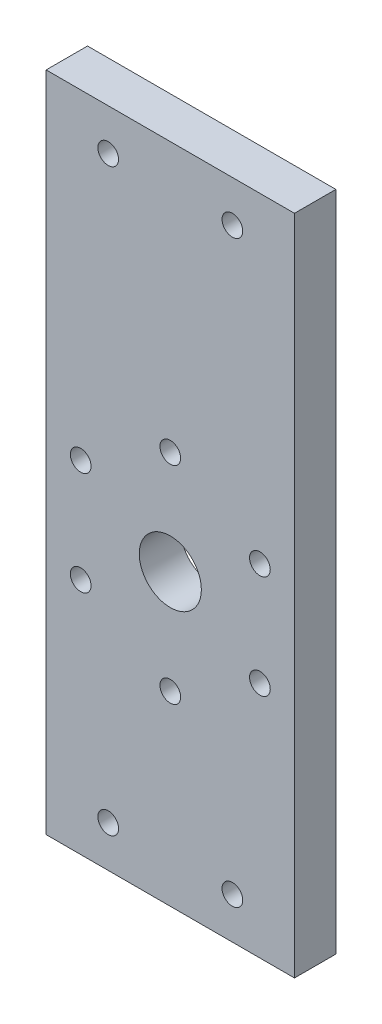
ISO-10303-21;
HEADER;
FILE_DESCRIPTION(('STEP AP214'),'2;1');
FILE_NAME('part.step','',(''),(''),'','','');
FILE_SCHEMA(('AUTOMOTIVE_DESIGN { 1 0 10303 214 1 1 1 1 }'));
ENDSEC;
DATA;
#1=APPLICATION_CONTEXT('core data for automotive mechanical design processes');
#2=APPLICATION_PROTOCOL_DEFINITION('international standard','automotive_design',2000,#1);
#3=PRODUCT_CONTEXT('',#1,'mechanical');
#4=PRODUCT('Part','Part','',(#3));
#5=PRODUCT_RELATED_PRODUCT_CATEGORY('part','',(#4));
#6=PRODUCT_DEFINITION_FORMATION('','',#4);
#7=PRODUCT_DEFINITION_CONTEXT('part definition',#1,'design');
#8=PRODUCT_DEFINITION('design','',#6,#7);
#9=PRODUCT_DEFINITION_SHAPE('','',#8);
#10=(LENGTH_UNIT() NAMED_UNIT(*) SI_UNIT(.MILLI.,.METRE.));
#11=(NAMED_UNIT(*) PLANE_ANGLE_UNIT() SI_UNIT($,.RADIAN.));
#12=(NAMED_UNIT(*) SI_UNIT($,.STERADIAN.) SOLID_ANGLE_UNIT());
#13=UNCERTAINTY_MEASURE_WITH_UNIT(LENGTH_MEASURE(1.E-05),#10,'distance_accuracy_value','');
#14=(GEOMETRIC_REPRESENTATION_CONTEXT(3) GLOBAL_UNCERTAINTY_ASSIGNED_CONTEXT((#13)) GLOBAL_UNIT_ASSIGNED_CONTEXT((#10,
#11,#12)) REPRESENTATION_CONTEXT('',''));
#15=CARTESIAN_POINT('',(0.,0.,0.));
#16=DIRECTION('',(0.,0.,1.));
#17=DIRECTION('',(1.,0.,0.));
#18=AXIS2_PLACEMENT_3D('',#15,#16,#17);
#19=CARTESIAN_POINT('',(0.,0.,12.7));
#20=DIRECTION('',(1.,0.,0.));
#21=DIRECTION('',(0.,0.,-1.));
#22=AXIS2_PLACEMENT_3D('',#19,#20,#21);
#23=PLANE('',#22);
#24=DIRECTION('',(0.,-1.,0.));
#25=VECTOR('',#24,1.);
#26=CARTESIAN_POINT('',(0.,0.,0.));
#27=LINE('',#26,#25);
#28=CARTESIAN_POINT('',(0.,203.2,0.));
#29=VERTEX_POINT('',#28);
#30=CARTESIAN_POINT('',(0.,0.,0.));
#31=VERTEX_POINT('',#30);
#32=EDGE_CURVE('E95',#29,#31,#27,.T.);
#33=ORIENTED_EDGE('',*,*,#32,.T.);
#34=DIRECTION('',(0.,0.,-1.));
#35=VECTOR('',#34,1.);
#36=CARTESIAN_POINT('',(0.,0.,12.7));
#37=LINE('',#36,#35);
#38=CARTESIAN_POINT('',(0.,0.,12.7));
#39=VERTEX_POINT('',#38);
#40=EDGE_CURVE('E11',#39,#31,#37,.T.);
#41=ORIENTED_EDGE('',*,*,#40,.F.);
#42=DIRECTION('',(0.,-1.,0.));
#43=VECTOR('',#42,1.);
#44=CARTESIAN_POINT('',(0.,0.,12.7));
#45=LINE('',#44,#43);
#46=CARTESIAN_POINT('',(0.,203.2,12.7));
#47=VERTEX_POINT('',#46);
#48=EDGE_CURVE('E83',#47,#39,#45,.T.);
#49=ORIENTED_EDGE('',*,*,#48,.F.);
#50=DIRECTION('',(0.,0.,-1.));
#51=VECTOR('',#50,1.);
#52=CARTESIAN_POINT('',(0.,203.2,12.7));
#53=LINE('',#52,#51);
#54=EDGE_CURVE('E91',#47,#29,#53,.T.);
#55=ORIENTED_EDGE('',*,*,#54,.T.);
#56=EDGE_LOOP('',(#33,#41,#49,#55));
#57=FACE_BOUND('',#56,.T.);
#58=ADVANCED_FACE('F32',(#57),#23,.F.);
#59=CARTESIAN_POINT('',(0.,0.,12.7));
#60=DIRECTION('',(0.,1.,0.));
#61=DIRECTION('',(0.,0.,1.));
#62=AXIS2_PLACEMENT_3D('',#59,#60,#61);
#63=PLANE('',#62);
#64=DIRECTION('',(1.,0.,0.));
#65=VECTOR('',#64,1.);
#66=CARTESIAN_POINT('',(0.,0.,0.));
#67=LINE('',#66,#65);
#68=CARTESIAN_POINT('',(76.2,0.,0.));
#69=VERTEX_POINT('',#68);
#70=EDGE_CURVE('E87',#31,#69,#67,.T.);
#71=ORIENTED_EDGE('',*,*,#70,.T.);
#72=DIRECTION('',(0.,0.,-1.));
#73=VECTOR('',#72,1.);
#74=CARTESIAN_POINT('',(76.2,0.,12.7));
#75=LINE('',#74,#73);
#76=CARTESIAN_POINT('',(76.2,0.,12.7));
#77=VERTEX_POINT('',#76);
#78=EDGE_CURVE('E40',#77,#69,#75,.T.);
#79=ORIENTED_EDGE('',*,*,#78,.F.);
#80=DIRECTION('',(1.,0.,0.));
#81=VECTOR('',#80,1.);
#82=CARTESIAN_POINT('',(0.,0.,12.7));
#83=LINE('',#82,#81);
#84=EDGE_CURVE('E78',#39,#77,#83,.T.);
#85=ORIENTED_EDGE('',*,*,#84,.F.);
#86=ORIENTED_EDGE('',*,*,#40,.T.);
#87=EDGE_LOOP('',(#71,#79,#85,#86));
#88=FACE_BOUND('',#87,.T.);
#89=ADVANCED_FACE('F86',(#88),#63,.F.);
#90=CARTESIAN_POINT('',(76.2,0.,12.7));
#91=DIRECTION('',(-1.,0.,0.));
#92=DIRECTION('',(0.,0.,1.));
#93=AXIS2_PLACEMENT_3D('',#90,#91,#92);
#94=PLANE('',#93);
#95=DIRECTION('',(0.,1.,0.));
#96=VECTOR('',#95,1.);
#97=CARTESIAN_POINT('',(76.2,0.,0.));
#98=LINE('',#97,#96);
#99=CARTESIAN_POINT('',(76.2,203.2,0.));
#100=VERTEX_POINT('',#99);
#101=EDGE_CURVE('E65',#69,#100,#98,.T.);
#102=ORIENTED_EDGE('',*,*,#101,.T.);
#103=DIRECTION('',(0.,0.,-1.));
#104=VECTOR('',#103,1.);
#105=CARTESIAN_POINT('',(76.2,203.2,12.7));
#106=LINE('',#105,#104);
#107=CARTESIAN_POINT('',(76.2,203.2,12.7));
#108=VERTEX_POINT('',#107);
#109=EDGE_CURVE('E88',#108,#100,#106,.T.);
#110=ORIENTED_EDGE('',*,*,#109,.F.);
#111=DIRECTION('',(0.,1.,0.));
#112=VECTOR('',#111,1.);
#113=CARTESIAN_POINT('',(76.2,0.,12.7));
#114=LINE('',#113,#112);
#115=EDGE_CURVE('E81',#77,#108,#114,.T.);
#116=ORIENTED_EDGE('',*,*,#115,.F.);
#117=ORIENTED_EDGE('',*,*,#78,.T.);
#118=EDGE_LOOP('',(#102,#110,#116,#117));
#119=FACE_BOUND('',#118,.T.);
#120=ADVANCED_FACE('F89',(#119),#94,.F.);
#121=CARTESIAN_POINT('',(0.,203.2,12.7));
#122=DIRECTION('',(0.,-1.,0.));
#123=DIRECTION('',(0.,0.,-1.));
#124=AXIS2_PLACEMENT_3D('',#121,#122,#123);
#125=PLANE('',#124);
#126=DIRECTION('',(-1.,0.,0.));
#127=VECTOR('',#126,1.);
#128=CARTESIAN_POINT('',(0.,203.2,0.));
#129=LINE('',#128,#127);
#130=EDGE_CURVE('E71',#100,#29,#129,.T.);
#131=ORIENTED_EDGE('',*,*,#130,.T.);
#132=ORIENTED_EDGE('',*,*,#54,.F.);
#133=DIRECTION('',(-1.,0.,0.));
#134=VECTOR('',#133,1.);
#135=CARTESIAN_POINT('',(0.,203.2,12.7));
#136=LINE('',#135,#134);
#137=EDGE_CURVE('E48',#108,#47,#136,.T.);
#138=ORIENTED_EDGE('',*,*,#137,.F.);
#139=ORIENTED_EDGE('',*,*,#109,.T.);
#140=EDGE_LOOP('',(#131,#132,#138,#139));
#141=FACE_BOUND('',#140,.T.);
#142=ADVANCED_FACE('F103',(#141),#125,.F.);
#143=CARTESIAN_POINT('',(0.,0.,12.7));
#144=DIRECTION('',(0.,0.,-1.));
#145=DIRECTION('',(-1.,0.,0.));
#146=AXIS2_PLACEMENT_3D('',#143,#144,#145);
#147=PLANE('',#146);
#148=CARTESIAN_POINT('',(38.1,120.65,12.7));
#149=DIRECTION('',(0.,0.,1.));
#150=DIRECTION('',(1.,0.,0.));
#151=AXIS2_PLACEMENT_3D('',#148,#149,#150);
#152=CIRCLE('',#151,3.175);
#153=CARTESIAN_POINT('',(41.275,120.65,12.7));
#154=VERTEX_POINT('',#153);
#155=EDGE_CURVE('E162',#154,#154,#152,.T.);
#156=ORIENTED_EDGE('',*,*,#155,.F.);
#157=EDGE_LOOP('',(#156));
#158=FACE_BOUND('',#157,.T.);
#159=CARTESIAN_POINT('',(10.6036934298447,104.775,12.7));
#160=DIRECTION('',(0.,0.,1.));
#161=DIRECTION('',(1.,0.,0.));
#162=AXIS2_PLACEMENT_3D('',#159,#160,#161);
#163=CIRCLE('',#162,3.17500000000001);
#164=CARTESIAN_POINT('',(13.7786934298447,104.775,12.7));
#165=VERTEX_POINT('',#164);
#166=EDGE_CURVE('E167',#165,#165,#163,.T.);
#167=ORIENTED_EDGE('',*,*,#166,.F.);
#168=EDGE_LOOP('',(#167));
#169=FACE_BOUND('',#168,.T.);
#170=CARTESIAN_POINT('',(10.6036934298441,73.025,12.7));
#171=DIRECTION('',(0.,0.,1.));
#172=DIRECTION('',(1.,0.,0.));
#173=AXIS2_PLACEMENT_3D('',#170,#171,#172);
#174=CIRCLE('',#173,3.17499999999877);
#175=CARTESIAN_POINT('',(13.7786934298429,73.025,12.7));
#176=VERTEX_POINT('',#175);
#177=EDGE_CURVE('E143',#176,#176,#174,.T.);
#178=ORIENTED_EDGE('',*,*,#177,.F.);
#179=EDGE_LOOP('',(#178));
#180=FACE_BOUND('',#179,.T.);
#181=CARTESIAN_POINT('',(38.1,57.15,12.7));
#182=DIRECTION('',(0.,0.,1.));
#183=DIRECTION('',(1.,0.,0.));
#184=AXIS2_PLACEMENT_3D('',#181,#182,#183);
#185=CIRCLE('',#184,3.1749999999985);
#186=CARTESIAN_POINT('',(41.2749999999985,57.15,12.7));
#187=VERTEX_POINT('',#186);
#188=EDGE_CURVE('E142',#187,#187,#185,.T.);
#189=ORIENTED_EDGE('',*,*,#188,.F.);
#190=EDGE_LOOP('',(#189));
#191=FACE_BOUND('',#190,.T.);
#192=CARTESIAN_POINT('',(65.5963065701559,73.025,12.7));
#193=DIRECTION('',(0.,0.,1.));
#194=DIRECTION('',(1.,0.,0.));
#195=AXIS2_PLACEMENT_3D('',#192,#193,#194);
#196=CIRCLE('',#195,3.17499999999907);
#197=CARTESIAN_POINT('',(68.771306570155,73.025,12.7));
#198=VERTEX_POINT('',#197);
#199=EDGE_CURVE('E150',#198,#198,#196,.T.);
#200=ORIENTED_EDGE('',*,*,#199,.F.);
#201=EDGE_LOOP('',(#200));
#202=FACE_BOUND('',#201,.T.);
#203=CARTESIAN_POINT('',(65.5963065701564,104.775000000001,12.7));
#204=DIRECTION('',(0.,0.,1.));
#205=DIRECTION('',(1.,0.,0.));
#206=AXIS2_PLACEMENT_3D('',#203,#204,#205);
#207=CIRCLE('',#206,3.17499999999999);
#208=CARTESIAN_POINT('',(68.7713065701564,104.775000000001,12.7));
#209=VERTEX_POINT('',#208);
#210=EDGE_CURVE('E156',#209,#209,#207,.T.);
#211=ORIENTED_EDGE('',*,*,#210,.F.);
#212=EDGE_LOOP('',(#211));
#213=FACE_BOUND('',#212,.T.);
#214=CARTESIAN_POINT('',(38.1,88.9,12.7));
#215=DIRECTION('',(0.,0.,1.));
#216=DIRECTION('',(1.,0.,0.));
#217=AXIS2_PLACEMENT_3D('',#214,#215,#216);
#218=CIRCLE('',#217,9.525);
#219=CARTESIAN_POINT('',(47.625,88.9,12.7));
#220=VERTEX_POINT('',#219);
#221=EDGE_CURVE('E135',#220,#220,#218,.T.);
#222=ORIENTED_EDGE('',*,*,#221,.F.);
#223=EDGE_LOOP('',(#222));
#224=FACE_BOUND('',#223,.T.);
#225=CARTESIAN_POINT('',(57.15,12.7,12.7));
#226=DIRECTION('',(0.,0.,-1.));
#227=DIRECTION('',(-1.,0.,0.));
#228=AXIS2_PLACEMENT_3D('',#225,#226,#227);
#229=CIRCLE('',#228,3.175);
#230=CARTESIAN_POINT('',(53.975,12.7,12.7));
#231=VERTEX_POINT('',#230);
#232=EDGE_CURVE('E115',#231,#231,#229,.F.);
#233=ORIENTED_EDGE('',*,*,#232,.F.);
#234=EDGE_LOOP('',(#233));
#235=FACE_BOUND('',#234,.T.);
#236=CARTESIAN_POINT('',(19.05,12.7,12.7));
#237=DIRECTION('',(0.,0.,-1.));
#238=DIRECTION('',(-1.,0.,0.));
#239=AXIS2_PLACEMENT_3D('',#236,#237,#238);
#240=CIRCLE('',#239,3.175);
#241=CARTESIAN_POINT('',(15.875,12.7,12.7));
#242=VERTEX_POINT('',#241);
#243=EDGE_CURVE('E123',#242,#242,#240,.F.);
#244=ORIENTED_EDGE('',*,*,#243,.F.);
#245=EDGE_LOOP('',(#244));
#246=FACE_BOUND('',#245,.T.);
#247=CARTESIAN_POINT('',(19.05,190.5,12.7));
#248=DIRECTION('',(0.,0.,-1.));
#249=DIRECTION('',(-1.,0.,0.));
#250=AXIS2_PLACEMENT_3D('',#247,#248,#249);
#251=CIRCLE('',#250,3.175);
#252=CARTESIAN_POINT('',(15.875,190.5,12.7));
#253=VERTEX_POINT('',#252);
#254=EDGE_CURVE('E114',#253,#253,#251,.F.);
#255=ORIENTED_EDGE('',*,*,#254,.F.);
#256=EDGE_LOOP('',(#255));
#257=FACE_BOUND('',#256,.T.);
#258=CARTESIAN_POINT('',(57.15,190.5,12.7));
#259=DIRECTION('',(0.,0.,-1.));
#260=DIRECTION('',(-1.,0.,0.));
#261=AXIS2_PLACEMENT_3D('',#258,#259,#260);
#262=CIRCLE('',#261,3.175);
#263=CARTESIAN_POINT('',(53.975,190.5,12.7));
#264=VERTEX_POINT('',#263);
#265=EDGE_CURVE('E98',#264,#264,#262,.F.);
#266=ORIENTED_EDGE('',*,*,#265,.F.);
#267=EDGE_LOOP('',(#266));
#268=FACE_BOUND('',#267,.T.);
#269=ORIENTED_EDGE('',*,*,#48,.T.);
#270=ORIENTED_EDGE('',*,*,#84,.T.);
#271=ORIENTED_EDGE('',*,*,#115,.T.);
#272=ORIENTED_EDGE('',*,*,#137,.T.);
#273=EDGE_LOOP('',(#269,#270,#271,#272));
#274=FACE_BOUND('',#273,.T.);
#275=ADVANCED_FACE('F79',(#158,#169,#180,#191,#202,#213,#224,#235,#246,#257,#268,#274),#147,.F.);
#276=CARTESIAN_POINT('',(0.,0.,0.));
#277=DIRECTION('',(0.,0.,-1.));
#278=DIRECTION('',(-1.,0.,0.));
#279=AXIS2_PLACEMENT_3D('',#276,#277,#278);
#280=PLANE('',#279);
#281=CARTESIAN_POINT('',(38.1,120.65,0.));
#282=DIRECTION('',(0.,0.,-1.));
#283=DIRECTION('',(-1.,0.,0.));
#284=AXIS2_PLACEMENT_3D('',#281,#282,#283);
#285=CIRCLE('',#284,3.175);
#286=CARTESIAN_POINT('',(34.925,120.65,0.));
#287=VERTEX_POINT('',#286);
#288=EDGE_CURVE('E138',#287,#287,#285,.F.);
#289=ORIENTED_EDGE('',*,*,#288,.T.);
#290=EDGE_LOOP('',(#289));
#291=FACE_BOUND('',#290,.T.);
#292=CARTESIAN_POINT('',(10.6036934298447,104.775,0.));
#293=DIRECTION('',(0.,0.,-1.));
#294=DIRECTION('',(-1.,0.,0.));
#295=AXIS2_PLACEMENT_3D('',#292,#293,#294);
#296=CIRCLE('',#295,3.17500000000001);
#297=CARTESIAN_POINT('',(7.42869342984469,104.775,0.));
#298=VERTEX_POINT('',#297);
#299=EDGE_CURVE('E146',#298,#298,#296,.F.);
#300=ORIENTED_EDGE('',*,*,#299,.T.);
#301=EDGE_LOOP('',(#300));
#302=FACE_BOUND('',#301,.T.);
#303=CARTESIAN_POINT('',(10.6036934298441,73.025,0.));
#304=DIRECTION('',(0.,0.,-1.));
#305=DIRECTION('',(-1.,0.,0.));
#306=AXIS2_PLACEMENT_3D('',#303,#304,#305);
#307=CIRCLE('',#306,3.17499999999877);
#308=CARTESIAN_POINT('',(7.42869342984531,73.025,0.));
#309=VERTEX_POINT('',#308);
#310=EDGE_CURVE('E139',#309,#309,#307,.F.);
#311=ORIENTED_EDGE('',*,*,#310,.T.);
#312=EDGE_LOOP('',(#311));
#313=FACE_BOUND('',#312,.T.);
#314=CARTESIAN_POINT('',(38.1,57.15,0.));
#315=DIRECTION('',(0.,0.,-1.));
#316=DIRECTION('',(-1.,0.,0.));
#317=AXIS2_PLACEMENT_3D('',#314,#315,#316);
#318=CIRCLE('',#317,3.1749999999985);
#319=CARTESIAN_POINT('',(34.9250000000015,57.15,0.));
#320=VERTEX_POINT('',#319);
#321=EDGE_CURVE('E147',#320,#320,#318,.F.);
#322=ORIENTED_EDGE('',*,*,#321,.T.);
#323=EDGE_LOOP('',(#322));
#324=FACE_BOUND('',#323,.T.);
#325=CARTESIAN_POINT('',(65.5963065701559,73.025,0.));
#326=DIRECTION('',(0.,0.,-1.));
#327=DIRECTION('',(-1.,0.,0.));
#328=AXIS2_PLACEMENT_3D('',#325,#326,#327);
#329=CIRCLE('',#328,3.17499999999907);
#330=CARTESIAN_POINT('',(62.4213065701568,73.025,0.));
#331=VERTEX_POINT('',#330);
#332=EDGE_CURVE('E153',#331,#331,#329,.F.);
#333=ORIENTED_EDGE('',*,*,#332,.T.);
#334=EDGE_LOOP('',(#333));
#335=FACE_BOUND('',#334,.T.);
#336=CARTESIAN_POINT('',(65.5963065701564,104.775000000001,0.));
#337=DIRECTION('',(0.,0.,-1.));
#338=DIRECTION('',(-1.,0.,0.));
#339=AXIS2_PLACEMENT_3D('',#336,#337,#338);
#340=CIRCLE('',#339,3.17499999999999);
#341=CARTESIAN_POINT('',(62.4213065701564,104.775000000001,0.));
#342=VERTEX_POINT('',#341);
#343=EDGE_CURVE('E159',#342,#342,#340,.F.);
#344=ORIENTED_EDGE('',*,*,#343,.T.);
#345=EDGE_LOOP('',(#344));
#346=FACE_BOUND('',#345,.T.);
#347=CARTESIAN_POINT('',(38.1,88.9,0.));
#348=DIRECTION('',(0.,0.,-1.));
#349=DIRECTION('',(-1.,0.,0.));
#350=AXIS2_PLACEMENT_3D('',#347,#348,#349);
#351=CIRCLE('',#350,9.525);
#352=CARTESIAN_POINT('',(28.575,88.9,0.));
#353=VERTEX_POINT('',#352);
#354=EDGE_CURVE('E122',#353,#353,#351,.F.);
#355=ORIENTED_EDGE('',*,*,#354,.T.);
#356=EDGE_LOOP('',(#355));
#357=FACE_BOUND('',#356,.T.);
#358=CARTESIAN_POINT('',(57.15,12.7,0.));
#359=DIRECTION('',(0.,0.,-1.));
#360=DIRECTION('',(-1.,0.,0.));
#361=AXIS2_PLACEMENT_3D('',#358,#359,#360);
#362=CIRCLE('',#361,3.175);
#363=CARTESIAN_POINT('',(53.975,12.7,0.));
#364=VERTEX_POINT('',#363);
#365=EDGE_CURVE('E119',#364,#364,#362,.T.);
#366=ORIENTED_EDGE('',*,*,#365,.F.);
#367=EDGE_LOOP('',(#366));
#368=FACE_BOUND('',#367,.T.);
#369=CARTESIAN_POINT('',(19.05,12.7,0.));
#370=DIRECTION('',(0.,0.,-1.));
#371=DIRECTION('',(-1.,0.,0.));
#372=AXIS2_PLACEMENT_3D('',#369,#370,#371);
#373=CIRCLE('',#372,3.175);
#374=CARTESIAN_POINT('',(15.875,12.7,0.));
#375=VERTEX_POINT('',#374);
#376=EDGE_CURVE('E118',#375,#375,#373,.T.);
#377=ORIENTED_EDGE('',*,*,#376,.F.);
#378=EDGE_LOOP('',(#377));
#379=FACE_BOUND('',#378,.T.);
#380=CARTESIAN_POINT('',(19.05,190.5,0.));
#381=DIRECTION('',(0.,0.,-1.));
#382=DIRECTION('',(-1.,0.,0.));
#383=AXIS2_PLACEMENT_3D('',#380,#381,#382);
#384=CIRCLE('',#383,3.175);
#385=CARTESIAN_POINT('',(15.875,190.5,0.));
#386=VERTEX_POINT('',#385);
#387=EDGE_CURVE('E126',#386,#386,#384,.T.);
#388=ORIENTED_EDGE('',*,*,#387,.F.);
#389=EDGE_LOOP('',(#388));
#390=FACE_BOUND('',#389,.T.);
#391=CARTESIAN_POINT('',(57.15,190.5,0.));
#392=DIRECTION('',(0.,0.,-1.));
#393=DIRECTION('',(-1.,0.,0.));
#394=AXIS2_PLACEMENT_3D('',#391,#392,#393);
#395=CIRCLE('',#394,3.175);
#396=CARTESIAN_POINT('',(53.975,190.5,0.));
#397=VERTEX_POINT('',#396);
#398=EDGE_CURVE('E111',#397,#397,#395,.T.);
#399=ORIENTED_EDGE('',*,*,#398,.F.);
#400=EDGE_LOOP('',(#399));
#401=FACE_BOUND('',#400,.T.);
#402=ORIENTED_EDGE('',*,*,#32,.F.);
#403=ORIENTED_EDGE('',*,*,#130,.F.);
#404=ORIENTED_EDGE('',*,*,#101,.F.);
#405=ORIENTED_EDGE('',*,*,#70,.F.);
#406=EDGE_LOOP('',(#402,#403,#404,#405));
#407=FACE_BOUND('',#406,.T.);
#408=ADVANCED_FACE('F106',(#291,#302,#313,#324,#335,#346,#357,#368,#379,#390,#401,#407),#280,.T.);
#409=CARTESIAN_POINT('',(57.15,190.5,21.6802561210692));
#410=DIRECTION('',(0.,0.,-1.));
#411=DIRECTION('',(-1.,0.,0.));
#412=AXIS2_PLACEMENT_3D('',#409,#410,#411);
#413=CYLINDRICAL_SURFACE('',#412,3.175);
#414=ORIENTED_EDGE('',*,*,#265,.T.);
#415=EDGE_LOOP('',(#414));
#416=FACE_BOUND('',#415,.T.);
#417=ORIENTED_EDGE('',*,*,#398,.T.);
#418=EDGE_LOOP('',(#417));
#419=FACE_BOUND('',#418,.T.);
#420=ADVANCED_FACE('F201',(#416,#419),#413,.F.);
#421=CARTESIAN_POINT('',(19.05,190.5,21.6802561210692));
#422=DIRECTION('',(0.,0.,-1.));
#423=DIRECTION('',(-1.,0.,0.));
#424=AXIS2_PLACEMENT_3D('',#421,#422,#423);
#425=CYLINDRICAL_SURFACE('',#424,3.175);
#426=ORIENTED_EDGE('',*,*,#254,.T.);
#427=EDGE_LOOP('',(#426));
#428=FACE_BOUND('',#427,.T.);
#429=ORIENTED_EDGE('',*,*,#387,.T.);
#430=EDGE_LOOP('',(#429));
#431=FACE_BOUND('',#430,.T.);
#432=ADVANCED_FACE('F204',(#428,#431),#425,.F.);
#433=CARTESIAN_POINT('',(19.05,12.7,21.6802561210692));
#434=DIRECTION('',(0.,0.,-1.));
#435=DIRECTION('',(-1.,0.,0.));
#436=AXIS2_PLACEMENT_3D('',#433,#434,#435);
#437=CYLINDRICAL_SURFACE('',#436,3.175);
#438=ORIENTED_EDGE('',*,*,#243,.T.);
#439=EDGE_LOOP('',(#438));
#440=FACE_BOUND('',#439,.T.);
#441=ORIENTED_EDGE('',*,*,#376,.T.);
#442=EDGE_LOOP('',(#441));
#443=FACE_BOUND('',#442,.T.);
#444=ADVANCED_FACE('F312',(#440,#443),#437,.F.);
#445=CARTESIAN_POINT('',(57.15,12.7,21.6802561210692));
#446=DIRECTION('',(0.,0.,-1.));
#447=DIRECTION('',(-1.,0.,0.));
#448=AXIS2_PLACEMENT_3D('',#445,#446,#447);
#449=CYLINDRICAL_SURFACE('',#448,3.175);
#450=ORIENTED_EDGE('',*,*,#232,.T.);
#451=EDGE_LOOP('',(#450));
#452=FACE_BOUND('',#451,.T.);
#453=ORIENTED_EDGE('',*,*,#365,.T.);
#454=EDGE_LOOP('',(#453));
#455=FACE_BOUND('',#454,.T.);
#456=ADVANCED_FACE('F308',(#452,#455),#449,.F.);
#457=CARTESIAN_POINT('',(38.1,88.9,-26.9407683632075));
#458=DIRECTION('',(0.,0.,1.));
#459=DIRECTION('',(1.,0.,0.));
#460=AXIS2_PLACEMENT_3D('',#457,#458,#459);
#461=CYLINDRICAL_SURFACE('',#460,9.525);
#462=ORIENTED_EDGE('',*,*,#221,.T.);
#463=EDGE_LOOP('',(#462));
#464=FACE_BOUND('',#463,.T.);
#465=ORIENTED_EDGE('',*,*,#354,.F.);
#466=EDGE_LOOP('',(#465));
#467=FACE_BOUND('',#466,.T.);
#468=ADVANCED_FACE('F239',(#464,#467),#461,.F.);
#469=CARTESIAN_POINT('',(65.5963065701564,104.775000000001,-8.98025612106919));
#470=DIRECTION('',(0.,0.,1.));
#471=DIRECTION('',(1.,0.,0.));
#472=AXIS2_PLACEMENT_3D('',#469,#470,#471);
#473=CYLINDRICAL_SURFACE('',#472,3.17499999999999);
#474=ORIENTED_EDGE('',*,*,#210,.T.);
#475=EDGE_LOOP('',(#474));
#476=FACE_BOUND('',#475,.T.);
#477=ORIENTED_EDGE('',*,*,#343,.F.);
#478=EDGE_LOOP('',(#477));
#479=FACE_BOUND('',#478,.T.);
#480=ADVANCED_FACE('F249',(#476,#479),#473,.F.);
#481=CARTESIAN_POINT('',(65.5963065701559,73.025,-8.98025612106919));
#482=DIRECTION('',(0.,0.,1.));
#483=DIRECTION('',(1.,0.,0.));
#484=AXIS2_PLACEMENT_3D('',#481,#482,#483);
#485=CYLINDRICAL_SURFACE('',#484,3.17499999999907);
#486=ORIENTED_EDGE('',*,*,#199,.T.);
#487=EDGE_LOOP('',(#486));
#488=FACE_BOUND('',#487,.T.);
#489=ORIENTED_EDGE('',*,*,#332,.F.);
#490=EDGE_LOOP('',(#489));
#491=FACE_BOUND('',#490,.T.);
#492=ADVANCED_FACE('F254',(#488,#491),#485,.F.);
#493=CARTESIAN_POINT('',(38.1,57.15,-8.98025612106919));
#494=DIRECTION('',(0.,0.,1.));
#495=DIRECTION('',(1.,0.,0.));
#496=AXIS2_PLACEMENT_3D('',#493,#494,#495);
#497=CYLINDRICAL_SURFACE('',#496,3.1749999999985);
#498=ORIENTED_EDGE('',*,*,#188,.T.);
#499=EDGE_LOOP('',(#498));
#500=FACE_BOUND('',#499,.T.);
#501=ORIENTED_EDGE('',*,*,#321,.F.);
#502=EDGE_LOOP('',(#501));
#503=FACE_BOUND('',#502,.T.);
#504=ADVANCED_FACE('F264',(#500,#503),#497,.F.);
#505=CARTESIAN_POINT('',(10.6036934298441,73.025,-8.98025612106919));
#506=DIRECTION('',(0.,0.,1.));
#507=DIRECTION('',(1.,0.,0.));
#508=AXIS2_PLACEMENT_3D('',#505,#506,#507);
#509=CYLINDRICAL_SURFACE('',#508,3.17499999999877);
#510=ORIENTED_EDGE('',*,*,#177,.T.);
#511=EDGE_LOOP('',(#510));
#512=FACE_BOUND('',#511,.T.);
#513=ORIENTED_EDGE('',*,*,#310,.F.);
#514=EDGE_LOOP('',(#513));
#515=FACE_BOUND('',#514,.T.);
#516=ADVANCED_FACE('F274',(#512,#515),#509,.F.);
#517=CARTESIAN_POINT('',(10.6036934298447,104.775,-8.98025612106919));
#518=DIRECTION('',(0.,0.,1.));
#519=DIRECTION('',(1.,0.,0.));
#520=AXIS2_PLACEMENT_3D('',#517,#518,#519);
#521=CYLINDRICAL_SURFACE('',#520,3.17500000000001);
#522=ORIENTED_EDGE('',*,*,#166,.T.);
#523=EDGE_LOOP('',(#522));
#524=FACE_BOUND('',#523,.T.);
#525=ORIENTED_EDGE('',*,*,#299,.F.);
#526=EDGE_LOOP('',(#525));
#527=FACE_BOUND('',#526,.T.);
#528=ADVANCED_FACE('F284',(#524,#527),#521,.F.);
#529=CARTESIAN_POINT('',(38.1,120.65,-8.98025612106919));
#530=DIRECTION('',(0.,0.,1.));
#531=DIRECTION('',(1.,0.,0.));
#532=AXIS2_PLACEMENT_3D('',#529,#530,#531);
#533=CYLINDRICAL_SURFACE('',#532,3.175);
#534=ORIENTED_EDGE('',*,*,#155,.T.);
#535=EDGE_LOOP('',(#534));
#536=FACE_BOUND('',#535,.T.);
#537=ORIENTED_EDGE('',*,*,#288,.F.);
#538=EDGE_LOOP('',(#537));
#539=FACE_BOUND('',#538,.T.);
#540=ADVANCED_FACE('F175',(#536,#539),#533,.F.);
#541=CLOSED_SHELL('',(#58,#89,#120,#142,#275,#408,#420,#432,#444,#456,#468,#480,#492,#504,#516,
#528,#540));
#542=MANIFOLD_SOLID_BREP('B2',#541);
#543=ADVANCED_BREP_SHAPE_REPRESENTATION('',(#18,#542),#14);
#544=SHAPE_DEFINITION_REPRESENTATION(#9,#543);
ENDSEC;
END-ISO-10303-21;
